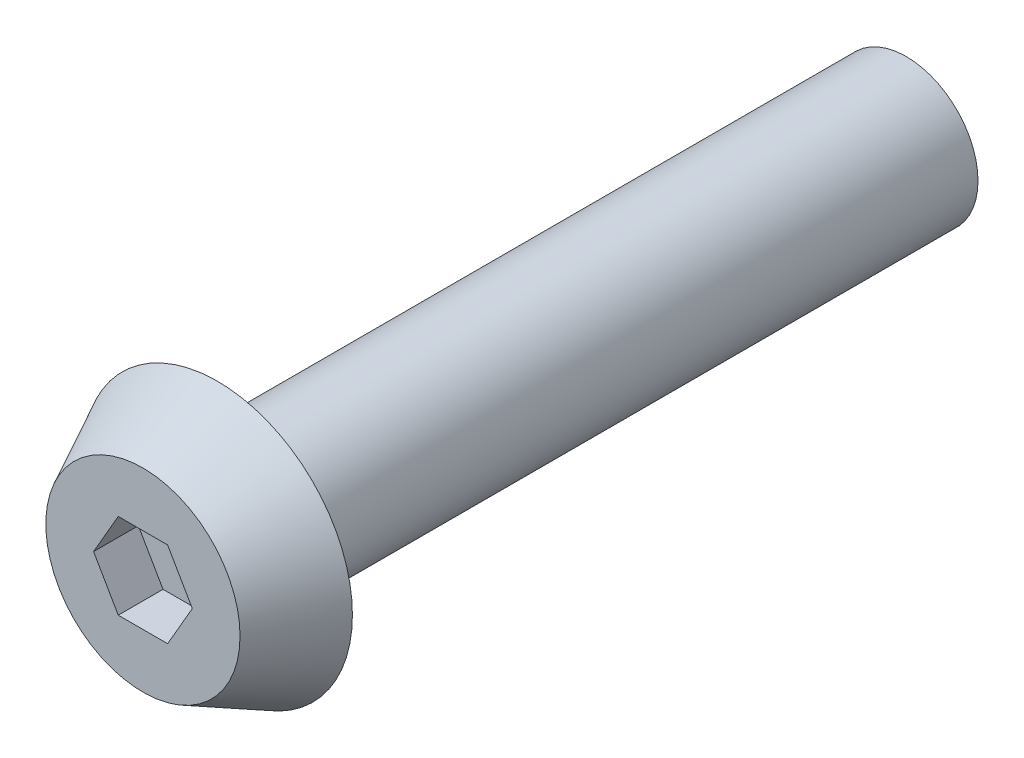
ISO-10303-21;
HEADER;
FILE_DESCRIPTION(('STEP AP214'),'2;1');
FILE_NAME('part.step','',(''),(''),'','','');
FILE_SCHEMA(('AUTOMOTIVE_DESIGN { 1 0 10303 214 1 1 1 1 }'));
ENDSEC;
DATA;
#1=APPLICATION_CONTEXT('core data for automotive mechanical design processes');
#2=APPLICATION_PROTOCOL_DEFINITION('international standard','automotive_design',2000,#1);
#3=PRODUCT_CONTEXT('',#1,'mechanical');
#4=PRODUCT('Part','Part','',(#3));
#5=PRODUCT_RELATED_PRODUCT_CATEGORY('part','',(#4));
#6=PRODUCT_DEFINITION_FORMATION('','',#4);
#7=PRODUCT_DEFINITION_CONTEXT('part definition',#1,'design');
#8=PRODUCT_DEFINITION('design','',#6,#7);
#9=PRODUCT_DEFINITION_SHAPE('','',#8);
#10=(LENGTH_UNIT() NAMED_UNIT(*) SI_UNIT(.MILLI.,.METRE.));
#11=(NAMED_UNIT(*) PLANE_ANGLE_UNIT() SI_UNIT($,.RADIAN.));
#12=(NAMED_UNIT(*) SI_UNIT($,.STERADIAN.) SOLID_ANGLE_UNIT());
#13=UNCERTAINTY_MEASURE_WITH_UNIT(LENGTH_MEASURE(1.E-05),#10,'distance_accuracy_value','');
#14=(GEOMETRIC_REPRESENTATION_CONTEXT(3) GLOBAL_UNCERTAINTY_ASSIGNED_CONTEXT((#13)) GLOBAL_UNIT_ASSIGNED_CONTEXT((#10,
#11,#12)) REPRESENTATION_CONTEXT('',''));
#15=CARTESIAN_POINT('',(0.,0.,0.));
#16=DIRECTION('',(0.,0.,1.));
#17=DIRECTION('',(1.,0.,0.));
#18=AXIS2_PLACEMENT_3D('',#15,#16,#17);
#19=CARTESIAN_POINT('',(0.,0.,1.3));
#20=DIRECTION('',(0.,0.,1.));
#21=DIRECTION('',(1.,0.,0.));
#22=AXIS2_PLACEMENT_3D('',#19,#20,#21);
#23=PLANE('',#22);
#24=CARTESIAN_POINT('',(0.,0.,1.3));
#25=DIRECTION('',(0.,0.,1.));
#26=DIRECTION('',(1.,0.,0.));
#27=AXIS2_PLACEMENT_3D('',#24,#25,#26);
#28=CIRCLE('',#27,1.692);
#29=CARTESIAN_POINT('',(1.692,0.,1.3));
#30=VERTEX_POINT('',#29);
#31=EDGE_CURVE('E131',#30,#30,#28,.T.);
#32=ORIENTED_EDGE('',*,*,#31,.T.);
#33=EDGE_LOOP('',(#32));
#34=FACE_BOUND('',#33,.T.);
#35=DIRECTION('',(1.,0.,0.));
#36=VECTOR('',#35,1.);
#37=CARTESIAN_POINT('',(0.,0.745,1.3));
#38=LINE('',#37,#36);
#39=CARTESIAN_POINT('',(-0.430125950546271,0.745,1.3));
#40=VERTEX_POINT('',#39);
#41=CARTESIAN_POINT('',(0.430125950546271,0.745,1.3));
#42=VERTEX_POINT('',#41);
#43=EDGE_CURVE('E47',#40,#42,#38,.T.);
#44=ORIENTED_EDGE('',*,*,#43,.T.);
#45=DIRECTION('',(0.5,-0.866025403784439,0.));
#46=VECTOR('',#45,1.);
#47=CARTESIAN_POINT('',(0.645188925819407,0.3725,1.3));
#48=LINE('',#47,#46);
#49=CARTESIAN_POINT('',(0.860251901092542,0.,1.3));
#50=VERTEX_POINT('',#49);
#51=EDGE_CURVE('E11',#42,#50,#48,.T.);
#52=ORIENTED_EDGE('',*,*,#51,.T.);
#53=DIRECTION('',(-0.5,-0.866025403784439,0.));
#54=VECTOR('',#53,1.);
#55=CARTESIAN_POINT('',(0.645188925819407,-0.3725,1.3));
#56=LINE('',#55,#54);
#57=CARTESIAN_POINT('',(0.430125950546271,-0.745,1.3));
#58=VERTEX_POINT('',#57);
#59=EDGE_CURVE('E138',#50,#58,#56,.T.);
#60=ORIENTED_EDGE('',*,*,#59,.T.);
#61=DIRECTION('',(-1.,0.,0.));
#62=VECTOR('',#61,1.);
#63=CARTESIAN_POINT('',(0.,-0.745,1.3));
#64=LINE('',#63,#62);
#65=CARTESIAN_POINT('',(-0.430125950546272,-0.745,1.3));
#66=VERTEX_POINT('',#65);
#67=EDGE_CURVE('E143',#58,#66,#64,.T.);
#68=ORIENTED_EDGE('',*,*,#67,.T.);
#69=DIRECTION('',(-0.5,0.866025403784439,0.));
#70=VECTOR('',#69,1.);
#71=CARTESIAN_POINT('',(-0.645188925819407,-0.3725,1.3));
#72=LINE('',#71,#70);
#73=CARTESIAN_POINT('',(-0.860251901092542,0.,1.3));
#74=VERTEX_POINT('',#73);
#75=EDGE_CURVE('E146',#66,#74,#72,.T.);
#76=ORIENTED_EDGE('',*,*,#75,.T.);
#77=DIRECTION('',(0.5,0.866025403784439,0.));
#78=VECTOR('',#77,1.);
#79=CARTESIAN_POINT('',(-0.645188925819407,0.3725,1.3));
#80=LINE('',#79,#78);
#81=EDGE_CURVE('E149',#74,#40,#80,.T.);
#82=ORIENTED_EDGE('',*,*,#81,.T.);
#83=EDGE_LOOP('',(#44,#52,#60,#68,#76,#82));
#84=FACE_BOUND('',#83,.T.);
#85=ADVANCED_FACE('F39',(#34,#84),#23,.T.);
#86=CARTESIAN_POINT('',(0.,0.,-12.));
#87=DIRECTION('',(0.,0.,1.));
#88=DIRECTION('',(1.,0.,0.));
#89=AXIS2_PLACEMENT_3D('',#86,#87,#88);
#90=CYLINDRICAL_SURFACE('',#89,1.25);
#91=CARTESIAN_POINT('',(0.,0.,-12.));
#92=DIRECTION('',(0.,0.,1.));
#93=DIRECTION('',(1.,0.,0.));
#94=AXIS2_PLACEMENT_3D('',#91,#92,#93);
#95=CIRCLE('',#94,1.25);
#96=CARTESIAN_POINT('',(1.25,0.,-12.));
#97=VERTEX_POINT('',#96);
#98=EDGE_CURVE('E135',#97,#97,#95,.T.);
#99=ORIENTED_EDGE('',*,*,#98,.T.);
#100=EDGE_LOOP('',(#99));
#101=FACE_BOUND('',#100,.T.);
#102=CARTESIAN_POINT('',(0.,0.,0.));
#103=DIRECTION('',(0.,0.,1.));
#104=DIRECTION('',(1.,0.,0.));
#105=AXIS2_PLACEMENT_3D('',#102,#103,#104);
#106=CIRCLE('',#105,1.25);
#107=CARTESIAN_POINT('',(1.25,0.,0.));
#108=VERTEX_POINT('',#107);
#109=EDGE_CURVE('E134',#108,#108,#106,.T.);
#110=ORIENTED_EDGE('',*,*,#109,.F.);
#111=EDGE_LOOP('',(#110));
#112=FACE_BOUND('',#111,.T.);
#113=ADVANCED_FACE('F41',(#101,#112),#90,.T.);
#114=CARTESIAN_POINT('',(0.,0.,-12.));
#115=DIRECTION('',(0.,0.,1.));
#116=DIRECTION('',(1.,0.,0.));
#117=AXIS2_PLACEMENT_3D('',#114,#115,#116);
#118=PLANE('',#117);
#119=ORIENTED_EDGE('',*,*,#98,.F.);
#120=EDGE_LOOP('',(#119));
#121=FACE_BOUND('',#120,.T.);
#122=ADVANCED_FACE('F177',(#121),#118,.F.);
#123=CARTESIAN_POINT('',(0.,0.,0.));
#124=DIRECTION('',(0.,0.,-1.));
#125=DIRECTION('',(1.,0.,0.));
#126=AXIS2_PLACEMENT_3D('',#123,#124,#125);
#127=CONICAL_SURFACE('',#126,2.35,0.468558557857025);
#128=ORIENTED_EDGE('',*,*,#31,.F.);
#129=EDGE_LOOP('',(#128));
#130=FACE_BOUND('',#129,.T.);
#131=CARTESIAN_POINT('',(0.,0.,0.));
#132=DIRECTION('',(0.,0.,1.));
#133=DIRECTION('',(1.,0.,0.));
#134=AXIS2_PLACEMENT_3D('',#131,#132,#133);
#135=CIRCLE('',#134,2.35);
#136=CARTESIAN_POINT('',(2.35,0.,0.));
#137=VERTEX_POINT('',#136);
#138=EDGE_CURVE('E96',#137,#137,#135,.T.);
#139=ORIENTED_EDGE('',*,*,#138,.T.);
#140=EDGE_LOOP('',(#139));
#141=FACE_BOUND('',#140,.T.);
#142=ADVANCED_FACE('F185',(#130,#141),#127,.T.);
#143=CARTESIAN_POINT('',(0.,0.,0.));
#144=DIRECTION('',(0.,0.,1.));
#145=DIRECTION('',(1.,0.,0.));
#146=AXIS2_PLACEMENT_3D('',#143,#144,#145);
#147=PLANE('',#146);
#148=ORIENTED_EDGE('',*,*,#109,.T.);
#149=EDGE_LOOP('',(#148));
#150=FACE_BOUND('',#149,.T.);
#151=ORIENTED_EDGE('',*,*,#138,.F.);
#152=EDGE_LOOP('',(#151));
#153=FACE_BOUND('',#152,.T.);
#154=ADVANCED_FACE('F182',(#150,#153),#147,.F.);
#155=CARTESIAN_POINT('',(0.430125950546271,0.745,1.8));
#156=DIRECTION('',(-0.866025403784439,-0.5,0.));
#157=DIRECTION('',(0.5,-0.866025403784439,0.));
#158=AXIS2_PLACEMENT_3D('',#155,#156,#157);
#159=PLANE('',#158);
#160=DIRECTION('',(0.,0.,-1.));
#161=VECTOR('',#160,1.);
#162=CARTESIAN_POINT('',(0.430125950546271,0.745,1.8));
#163=LINE('',#162,#161);
#164=CARTESIAN_POINT('',(0.430125950546271,0.745,0.52));
#165=VERTEX_POINT('',#164);
#166=EDGE_CURVE('E89',#42,#165,#163,.T.);
#167=ORIENTED_EDGE('',*,*,#166,.T.);
#168=DIRECTION('',(-0.5,0.866025403784438,0.));
#169=VECTOR('',#168,1.);
#170=CARTESIAN_POINT('',(0.430125950546271,0.745,0.52));
#171=LINE('',#170,#169);
#172=CARTESIAN_POINT('',(0.860251901092542,0.,0.52));
#173=VERTEX_POINT('',#172);
#174=EDGE_CURVE('E93',#173,#165,#171,.T.);
#175=ORIENTED_EDGE('',*,*,#174,.F.);
#176=DIRECTION('',(0.,0.,-1.));
#177=VECTOR('',#176,1.);
#178=CARTESIAN_POINT('',(0.860251901092542,0.,1.8));
#179=LINE('',#178,#177);
#180=EDGE_CURVE('E121',#50,#173,#179,.T.);
#181=ORIENTED_EDGE('',*,*,#180,.F.);
#182=ORIENTED_EDGE('',*,*,#51,.F.);
#183=EDGE_LOOP('',(#167,#175,#181,#182));
#184=FACE_BOUND('',#183,.T.);
#185=ADVANCED_FACE('F91',(#184),#159,.T.);
#186=CARTESIAN_POINT('',(-0.430125950546271,0.745,1.8));
#187=DIRECTION('',(0.,-1.,0.));
#188=DIRECTION('',(1.,0.,0.));
#189=AXIS2_PLACEMENT_3D('',#186,#187,#188);
#190=PLANE('',#189);
#191=DIRECTION('',(0.,0.,-1.));
#192=VECTOR('',#191,1.);
#193=CARTESIAN_POINT('',(-0.430125950546271,0.745,1.8));
#194=LINE('',#193,#192);
#195=CARTESIAN_POINT('',(-0.430125950546271,0.745,0.52));
#196=VERTEX_POINT('',#195);
#197=EDGE_CURVE('E97',#40,#196,#194,.T.);
#198=ORIENTED_EDGE('',*,*,#197,.T.);
#199=DIRECTION('',(-1.,0.,0.));
#200=VECTOR('',#199,1.);
#201=CARTESIAN_POINT('',(-0.430125950546271,0.745,0.52));
#202=LINE('',#201,#200);
#203=EDGE_CURVE('E100',#165,#196,#202,.T.);
#204=ORIENTED_EDGE('',*,*,#203,.F.);
#205=ORIENTED_EDGE('',*,*,#166,.F.);
#206=ORIENTED_EDGE('',*,*,#43,.F.);
#207=EDGE_LOOP('',(#198,#204,#205,#206));
#208=FACE_BOUND('',#207,.T.);
#209=ADVANCED_FACE('F101',(#208),#190,.T.);
#210=CARTESIAN_POINT('',(-0.860251901092542,0.,1.8));
#211=DIRECTION('',(0.866025403784438,-0.5,0.));
#212=DIRECTION('',(0.5,0.866025403784439,0.));
#213=AXIS2_PLACEMENT_3D('',#210,#211,#212);
#214=PLANE('',#213);
#215=DIRECTION('',(0.,0.,-1.));
#216=VECTOR('',#215,1.);
#217=CARTESIAN_POINT('',(-0.860251901092542,0.,1.8));
#218=LINE('',#217,#216);
#219=CARTESIAN_POINT('',(-0.860251901092542,0.,0.52));
#220=VERTEX_POINT('',#219);
#221=EDGE_CURVE('E126',#74,#220,#218,.T.);
#222=ORIENTED_EDGE('',*,*,#221,.T.);
#223=DIRECTION('',(-0.5,-0.866025403784438,0.));
#224=VECTOR('',#223,1.);
#225=CARTESIAN_POINT('',(-0.860251901092542,0.,0.52));
#226=LINE('',#225,#224);
#227=EDGE_CURVE('E106',#196,#220,#226,.T.);
#228=ORIENTED_EDGE('',*,*,#227,.F.);
#229=ORIENTED_EDGE('',*,*,#197,.F.);
#230=ORIENTED_EDGE('',*,*,#81,.F.);
#231=EDGE_LOOP('',(#222,#228,#229,#230));
#232=FACE_BOUND('',#231,.T.);
#233=ADVANCED_FACE('F153',(#232),#214,.T.);
#234=CARTESIAN_POINT('',(-0.430125950546272,-0.745,1.8));
#235=DIRECTION('',(0.866025403784439,0.5,0.));
#236=DIRECTION('',(-0.5,0.866025403784439,0.));
#237=AXIS2_PLACEMENT_3D('',#234,#235,#236);
#238=PLANE('',#237);
#239=DIRECTION('',(0.,0.,-1.));
#240=VECTOR('',#239,1.);
#241=CARTESIAN_POINT('',(-0.430125950546272,-0.745,1.8));
#242=LINE('',#241,#240);
#243=CARTESIAN_POINT('',(-0.430125950546272,-0.745,0.52));
#244=VERTEX_POINT('',#243);
#245=EDGE_CURVE('E124',#66,#244,#242,.T.);
#246=ORIENTED_EDGE('',*,*,#245,.T.);
#247=DIRECTION('',(0.5,-0.866025403784439,0.));
#248=VECTOR('',#247,1.);
#249=CARTESIAN_POINT('',(-0.430125950546272,-0.745,0.52));
#250=LINE('',#249,#248);
#251=EDGE_CURVE('E115',#220,#244,#250,.T.);
#252=ORIENTED_EDGE('',*,*,#251,.F.);
#253=ORIENTED_EDGE('',*,*,#221,.F.);
#254=ORIENTED_EDGE('',*,*,#75,.F.);
#255=EDGE_LOOP('',(#246,#252,#253,#254));
#256=FACE_BOUND('',#255,.T.);
#257=ADVANCED_FACE('F158',(#256),#238,.T.);
#258=CARTESIAN_POINT('',(0.430125950546271,-0.745,1.8));
#259=DIRECTION('',(0.,1.,0.));
#260=DIRECTION('',(-1.,0.,0.));
#261=AXIS2_PLACEMENT_3D('',#258,#259,#260);
#262=PLANE('',#261);
#263=DIRECTION('',(0.,0.,-1.));
#264=VECTOR('',#263,1.);
#265=CARTESIAN_POINT('',(0.430125950546271,-0.745,1.8));
#266=LINE('',#265,#264);
#267=CARTESIAN_POINT('',(0.430125950546271,-0.745,0.52));
#268=VERTEX_POINT('',#267);
#269=EDGE_CURVE('E54',#58,#268,#266,.T.);
#270=ORIENTED_EDGE('',*,*,#269,.T.);
#271=DIRECTION('',(1.,0.,0.));
#272=VECTOR('',#271,1.);
#273=CARTESIAN_POINT('',(0.430125950546271,-0.745,0.52));
#274=LINE('',#273,#272);
#275=EDGE_CURVE('E118',#244,#268,#274,.T.);
#276=ORIENTED_EDGE('',*,*,#275,.F.);
#277=ORIENTED_EDGE('',*,*,#245,.F.);
#278=ORIENTED_EDGE('',*,*,#67,.F.);
#279=EDGE_LOOP('',(#270,#276,#277,#278));
#280=FACE_BOUND('',#279,.T.);
#281=ADVANCED_FACE('F161',(#280),#262,.T.);
#282=CARTESIAN_POINT('',(0.860251901092542,0.,1.8));
#283=DIRECTION('',(-0.866025403784439,0.5,0.));
#284=DIRECTION('',(-0.5,-0.866025403784439,0.));
#285=AXIS2_PLACEMENT_3D('',#282,#283,#284);
#286=PLANE('',#285);
#287=ORIENTED_EDGE('',*,*,#180,.T.);
#288=DIRECTION('',(0.5,0.866025403784438,0.));
#289=VECTOR('',#288,1.);
#290=CARTESIAN_POINT('',(0.860251901092542,0.,0.52));
#291=LINE('',#290,#289);
#292=EDGE_CURVE('E111',#268,#173,#291,.T.);
#293=ORIENTED_EDGE('',*,*,#292,.F.);
#294=ORIENTED_EDGE('',*,*,#269,.F.);
#295=ORIENTED_EDGE('',*,*,#59,.F.);
#296=EDGE_LOOP('',(#287,#293,#294,#295));
#297=FACE_BOUND('',#296,.T.);
#298=ADVANCED_FACE('F162',(#297),#286,.T.);
#299=CARTESIAN_POINT('',(0.,0.,0.52));
#300=DIRECTION('',(0.,0.,-1.));
#301=DIRECTION('',(-1.,0.,0.));
#302=AXIS2_PLACEMENT_3D('',#299,#300,#301);
#303=PLANE('',#302);
#304=ORIENTED_EDGE('',*,*,#174,.T.);
#305=ORIENTED_EDGE('',*,*,#203,.T.);
#306=ORIENTED_EDGE('',*,*,#227,.T.);
#307=ORIENTED_EDGE('',*,*,#251,.T.);
#308=ORIENTED_EDGE('',*,*,#275,.T.);
#309=ORIENTED_EDGE('',*,*,#292,.T.);
#310=EDGE_LOOP('',(#304,#305,#306,#307,#308,#309));
#311=FACE_BOUND('',#310,.T.);
#312=ADVANCED_FACE('F109',(#311),#303,.F.);
#313=CLOSED_SHELL('',(#85,#113,#122,#142,#154,#185,#209,#233,#257,#281,#298,#312));
#314=MANIFOLD_SOLID_BREP('B2',#313);
#315=ADVANCED_BREP_SHAPE_REPRESENTATION('',(#18,#314),#14);
#316=SHAPE_DEFINITION_REPRESENTATION(#9,#315);
ENDSEC;
END-ISO-10303-21;
